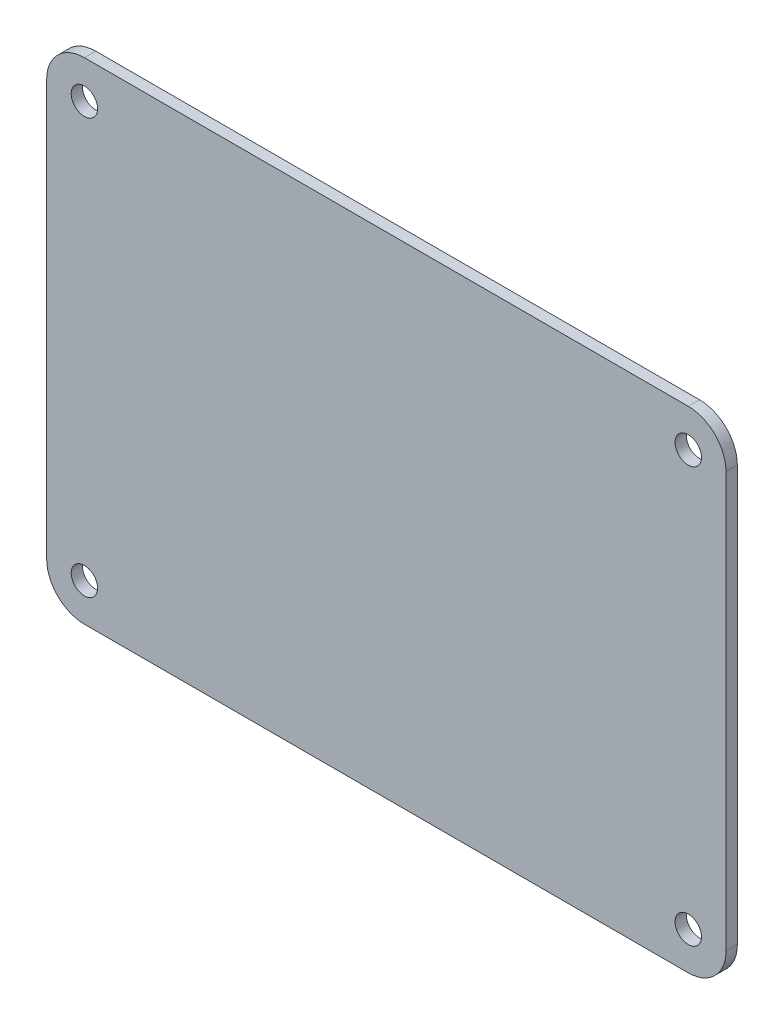
ISO-10303-21;
HEADER;
FILE_DESCRIPTION(('STEP AP214'),'2;1');
FILE_NAME('part.step','',(''),(''),'','','');
FILE_SCHEMA(('AUTOMOTIVE_DESIGN { 1 0 10303 214 1 1 1 1 }'));
ENDSEC;
DATA;
#1=APPLICATION_CONTEXT('core data for automotive mechanical design processes');
#2=APPLICATION_PROTOCOL_DEFINITION('international standard','automotive_design',2000,#1);
#3=PRODUCT_CONTEXT('',#1,'mechanical');
#4=PRODUCT('Part','Part','',(#3));
#5=PRODUCT_RELATED_PRODUCT_CATEGORY('part','',(#4));
#6=PRODUCT_DEFINITION_FORMATION('','',#4);
#7=PRODUCT_DEFINITION_CONTEXT('part definition',#1,'design');
#8=PRODUCT_DEFINITION('design','',#6,#7);
#9=PRODUCT_DEFINITION_SHAPE('','',#8);
#10=(LENGTH_UNIT() NAMED_UNIT(*) SI_UNIT(.MILLI.,.METRE.));
#11=(NAMED_UNIT(*) PLANE_ANGLE_UNIT() SI_UNIT($,.RADIAN.));
#12=(NAMED_UNIT(*) SI_UNIT($,.STERADIAN.) SOLID_ANGLE_UNIT());
#13=UNCERTAINTY_MEASURE_WITH_UNIT(LENGTH_MEASURE(1.E-05),#10,'distance_accuracy_value','');
#14=(GEOMETRIC_REPRESENTATION_CONTEXT(3) GLOBAL_UNCERTAINTY_ASSIGNED_CONTEXT((#13)) GLOBAL_UNIT_ASSIGNED_CONTEXT((#10,
#11,#12)) REPRESENTATION_CONTEXT('',''));
#15=CARTESIAN_POINT('',(0.,0.,0.));
#16=DIRECTION('',(0.,0.,1.));
#17=DIRECTION('',(1.,0.,0.));
#18=AXIS2_PLACEMENT_3D('',#15,#16,#17);
#19=CARTESIAN_POINT('',(90.,65.,3.));
#20=DIRECTION('',(-1.,0.,0.));
#21=DIRECTION('',(0.,-1.,0.));
#22=AXIS2_PLACEMENT_3D('',#19,#20,#21);
#23=PLANE('',#22);
#24=DIRECTION('',(0.,1.,0.));
#25=VECTOR('',#24,1.);
#26=CARTESIAN_POINT('',(90.,65.,0.));
#27=LINE('',#26,#25);
#28=CARTESIAN_POINT('',(90.,-55.,0.));
#29=VERTEX_POINT('',#28);
#30=CARTESIAN_POINT('',(90.,55.,0.));
#31=VERTEX_POINT('',#30);
#32=EDGE_CURVE('E129',#29,#31,#27,.T.);
#33=ORIENTED_EDGE('',*,*,#32,.T.);
#34=DIRECTION('',(0.,0.,-1.));
#35=VECTOR('',#34,1.);
#36=CARTESIAN_POINT('',(90.,55.,3.));
#37=LINE('',#36,#35);
#38=CARTESIAN_POINT('',(90.,55.,3.));
#39=VERTEX_POINT('',#38);
#40=EDGE_CURVE('E152',#31,#39,#37,.F.);
#41=ORIENTED_EDGE('',*,*,#40,.T.);
#42=DIRECTION('',(0.,1.,0.));
#43=VECTOR('',#42,1.);
#44=CARTESIAN_POINT('',(90.,65.,3.));
#45=LINE('',#44,#43);
#46=CARTESIAN_POINT('',(90.,-55.,3.));
#47=VERTEX_POINT('',#46);
#48=EDGE_CURVE('E127',#47,#39,#45,.T.);
#49=ORIENTED_EDGE('',*,*,#48,.F.);
#50=DIRECTION('',(0.,0.,-1.));
#51=VECTOR('',#50,1.);
#52=CARTESIAN_POINT('',(90.,-55.,3.));
#53=LINE('',#52,#51);
#54=EDGE_CURVE('E149',#47,#29,#53,.T.);
#55=ORIENTED_EDGE('',*,*,#54,.T.);
#56=EDGE_LOOP('',(#33,#41,#49,#55));
#57=FACE_BOUND('',#56,.T.);
#58=ADVANCED_FACE('F34',(#57),#23,.F.);
#59=CARTESIAN_POINT('',(-90.,65.,3.));
#60=DIRECTION('',(0.,-1.,0.));
#61=DIRECTION('',(0.,0.,-1.));
#62=AXIS2_PLACEMENT_3D('',#59,#60,#61);
#63=PLANE('',#62);
#64=DIRECTION('',(-1.,0.,0.));
#65=VECTOR('',#64,1.);
#66=CARTESIAN_POINT('',(-90.,65.,0.));
#67=LINE('',#66,#65);
#68=CARTESIAN_POINT('',(79.9999999999999,65.,0.));
#69=VERTEX_POINT('',#68);
#70=CARTESIAN_POINT('',(-80.,65.,0.));
#71=VERTEX_POINT('',#70);
#72=EDGE_CURVE('E125',#69,#71,#67,.T.);
#73=ORIENTED_EDGE('',*,*,#72,.T.);
#74=DIRECTION('',(0.,0.,-1.));
#75=VECTOR('',#74,1.);
#76=CARTESIAN_POINT('',(-80.,65.,3.));
#77=LINE('',#76,#75);
#78=CARTESIAN_POINT('',(-80.,65.,3.));
#79=VERTEX_POINT('',#78);
#80=EDGE_CURVE('E104',#71,#79,#77,.F.);
#81=ORIENTED_EDGE('',*,*,#80,.T.);
#82=DIRECTION('',(-1.,0.,0.));
#83=VECTOR('',#82,1.);
#84=CARTESIAN_POINT('',(-90.,65.,3.));
#85=LINE('',#84,#83);
#86=CARTESIAN_POINT('',(79.9999999999999,65.,3.));
#87=VERTEX_POINT('',#86);
#88=EDGE_CURVE('E168',#87,#79,#85,.T.);
#89=ORIENTED_EDGE('',*,*,#88,.F.);
#90=DIRECTION('',(0.,0.,-1.));
#91=VECTOR('',#90,1.);
#92=CARTESIAN_POINT('',(80.,65.,3.));
#93=LINE('',#92,#91);
#94=EDGE_CURVE('E109',#87,#69,#93,.T.);
#95=ORIENTED_EDGE('',*,*,#94,.T.);
#96=EDGE_LOOP('',(#73,#81,#89,#95));
#97=FACE_BOUND('',#96,.T.);
#98=ADVANCED_FACE('F223',(#97),#63,.F.);
#99=CARTESIAN_POINT('',(-90.,65.,3.));
#100=DIRECTION('',(1.,0.,0.));
#101=DIRECTION('',(0.,1.,0.));
#102=AXIS2_PLACEMENT_3D('',#99,#100,#101);
#103=PLANE('',#102);
#104=DIRECTION('',(0.,-1.,0.));
#105=VECTOR('',#104,1.);
#106=CARTESIAN_POINT('',(-90.,65.,3.));
#107=LINE('',#106,#105);
#108=CARTESIAN_POINT('',(-90.,55.,3.));
#109=VERTEX_POINT('',#108);
#110=CARTESIAN_POINT('',(-90.,-55.,3.));
#111=VERTEX_POINT('',#110);
#112=EDGE_CURVE('E118',#109,#111,#107,.T.);
#113=ORIENTED_EDGE('',*,*,#112,.F.);
#114=DIRECTION('',(0.,0.,-1.));
#115=VECTOR('',#114,1.);
#116=CARTESIAN_POINT('',(-90.,55.,3.));
#117=LINE('',#116,#115);
#118=CARTESIAN_POINT('',(-90.,55.,0.));
#119=VERTEX_POINT('',#118);
#120=EDGE_CURVE('E103',#109,#119,#117,.T.);
#121=ORIENTED_EDGE('',*,*,#120,.T.);
#122=DIRECTION('',(0.,-1.,0.));
#123=VECTOR('',#122,1.);
#124=CARTESIAN_POINT('',(-90.,65.,0.));
#125=LINE('',#124,#123);
#126=CARTESIAN_POINT('',(-90.,-55.,0.));
#127=VERTEX_POINT('',#126);
#128=EDGE_CURVE('E116',#119,#127,#125,.T.);
#129=ORIENTED_EDGE('',*,*,#128,.T.);
#130=DIRECTION('',(0.,0.,-1.));
#131=VECTOR('',#130,1.);
#132=CARTESIAN_POINT('',(-90.,-55.,3.));
#133=LINE('',#132,#131);
#134=EDGE_CURVE('E120',#127,#111,#133,.F.);
#135=ORIENTED_EDGE('',*,*,#134,.T.);
#136=EDGE_LOOP('',(#113,#121,#129,#135));
#137=FACE_BOUND('',#136,.T.);
#138=ADVANCED_FACE('F115',(#137),#103,.F.);
#139=CARTESIAN_POINT('',(-90.,-65.,3.));
#140=DIRECTION('',(0.,1.,0.));
#141=DIRECTION('',(0.,0.,1.));
#142=AXIS2_PLACEMENT_3D('',#139,#140,#141);
#143=PLANE('',#142);
#144=DIRECTION('',(1.,0.,0.));
#145=VECTOR('',#144,1.);
#146=CARTESIAN_POINT('',(-90.,-65.,0.));
#147=LINE('',#146,#145);
#148=CARTESIAN_POINT('',(-80.,-65.,0.));
#149=VERTEX_POINT('',#148);
#150=CARTESIAN_POINT('',(80.,-65.,0.));
#151=VERTEX_POINT('',#150);
#152=EDGE_CURVE('E124',#149,#151,#147,.T.);
#153=ORIENTED_EDGE('',*,*,#152,.T.);
#154=DIRECTION('',(0.,0.,-1.));
#155=VECTOR('',#154,1.);
#156=CARTESIAN_POINT('',(80.,-65.,3.));
#157=LINE('',#156,#155);
#158=CARTESIAN_POINT('',(80.,-65.,3.));
#159=VERTEX_POINT('',#158);
#160=EDGE_CURVE('E11',#151,#159,#157,.F.);
#161=ORIENTED_EDGE('',*,*,#160,.T.);
#162=DIRECTION('',(1.,0.,0.));
#163=VECTOR('',#162,1.);
#164=CARTESIAN_POINT('',(-90.,-65.,3.));
#165=LINE('',#164,#163);
#166=CARTESIAN_POINT('',(-80.,-65.,3.));
#167=VERTEX_POINT('',#166);
#168=EDGE_CURVE('E133',#167,#159,#165,.T.);
#169=ORIENTED_EDGE('',*,*,#168,.F.);
#170=DIRECTION('',(0.,0.,-1.));
#171=VECTOR('',#170,1.);
#172=CARTESIAN_POINT('',(-80.,-65.,3.));
#173=LINE('',#172,#171);
#174=EDGE_CURVE('E42',#167,#149,#173,.T.);
#175=ORIENTED_EDGE('',*,*,#174,.T.);
#176=EDGE_LOOP('',(#153,#161,#169,#175));
#177=FACE_BOUND('',#176,.T.);
#178=ADVANCED_FACE('F155',(#177),#143,.F.);
#179=CARTESIAN_POINT('',(90.,-65.,3.));
#180=DIRECTION('',(0.,0.,1.));
#181=DIRECTION('',(1.,0.,0.));
#182=AXIS2_PLACEMENT_3D('',#179,#180,#181);
#183=PLANE('',#182);
#184=CARTESIAN_POINT('',(80.,-55.,3.));
#185=DIRECTION('',(0.,0.,1.));
#186=DIRECTION('',(1.,0.,0.));
#187=AXIS2_PLACEMENT_3D('',#184,#185,#186);
#188=CIRCLE('',#187,3.50000000000001);
#189=CARTESIAN_POINT('',(83.5,-55.,3.));
#190=VERTEX_POINT('',#189);
#191=EDGE_CURVE('E196',#190,#190,#188,.T.);
#192=ORIENTED_EDGE('',*,*,#191,.F.);
#193=EDGE_LOOP('',(#192));
#194=FACE_BOUND('',#193,.T.);
#195=CARTESIAN_POINT('',(80.,55.,3.));
#196=DIRECTION('',(0.,0.,1.));
#197=DIRECTION('',(1.,0.,0.));
#198=AXIS2_PLACEMENT_3D('',#195,#196,#197);
#199=CIRCLE('',#198,3.50000000000001);
#200=CARTESIAN_POINT('',(83.5,55.,3.));
#201=VERTEX_POINT('',#200);
#202=EDGE_CURVE('E190',#201,#201,#199,.T.);
#203=ORIENTED_EDGE('',*,*,#202,.F.);
#204=EDGE_LOOP('',(#203));
#205=FACE_BOUND('',#204,.T.);
#206=CARTESIAN_POINT('',(-80.,-55.,3.));
#207=DIRECTION('',(0.,0.,1.));
#208=DIRECTION('',(1.,0.,0.));
#209=AXIS2_PLACEMENT_3D('',#206,#207,#208);
#210=CIRCLE('',#209,3.50000000000001);
#211=CARTESIAN_POINT('',(-76.5,-55.,3.));
#212=VERTEX_POINT('',#211);
#213=EDGE_CURVE('E184',#212,#212,#210,.T.);
#214=ORIENTED_EDGE('',*,*,#213,.F.);
#215=EDGE_LOOP('',(#214));
#216=FACE_BOUND('',#215,.T.);
#217=CARTESIAN_POINT('',(-80.,55.,3.));
#218=DIRECTION('',(0.,0.,1.));
#219=DIRECTION('',(1.,0.,0.));
#220=AXIS2_PLACEMENT_3D('',#217,#218,#219);
#221=CIRCLE('',#220,3.50000000000001);
#222=CARTESIAN_POINT('',(-76.5,55.,3.));
#223=VERTEX_POINT('',#222);
#224=EDGE_CURVE('E173',#223,#223,#221,.T.);
#225=ORIENTED_EDGE('',*,*,#224,.F.);
#226=EDGE_LOOP('',(#225));
#227=FACE_BOUND('',#226,.T.);
#228=ORIENTED_EDGE('',*,*,#88,.T.);
#229=CARTESIAN_POINT('',(-80.,55.,3.));
#230=DIRECTION('',(0.,0.,1.));
#231=DIRECTION('',(1.,0.,0.));
#232=AXIS2_PLACEMENT_3D('',#229,#230,#231);
#233=CIRCLE('',#232,10.);
#234=EDGE_CURVE('E147',#79,#109,#233,.T.);
#235=ORIENTED_EDGE('',*,*,#234,.T.);
#236=ORIENTED_EDGE('',*,*,#112,.T.);
#237=CARTESIAN_POINT('',(-80.,-55.,3.));
#238=DIRECTION('',(0.,0.,1.));
#239=DIRECTION('',(1.,0.,0.));
#240=AXIS2_PLACEMENT_3D('',#237,#238,#239);
#241=CIRCLE('',#240,10.);
#242=EDGE_CURVE('E54',#111,#167,#241,.T.);
#243=ORIENTED_EDGE('',*,*,#242,.T.);
#244=ORIENTED_EDGE('',*,*,#168,.T.);
#245=CARTESIAN_POINT('',(80.,-55.,3.));
#246=DIRECTION('',(0.,0.,1.));
#247=DIRECTION('',(1.,0.,0.));
#248=AXIS2_PLACEMENT_3D('',#245,#246,#247);
#249=CIRCLE('',#248,10.);
#250=EDGE_CURVE('E143',#159,#47,#249,.T.);
#251=ORIENTED_EDGE('',*,*,#250,.T.);
#252=ORIENTED_EDGE('',*,*,#48,.T.);
#253=CARTESIAN_POINT('',(80.,55.,3.));
#254=DIRECTION('',(0.,0.,1.));
#255=DIRECTION('',(1.,0.,0.));
#256=AXIS2_PLACEMENT_3D('',#253,#254,#255);
#257=CIRCLE('',#256,10.);
#258=EDGE_CURVE('E145',#39,#87,#257,.T.);
#259=ORIENTED_EDGE('',*,*,#258,.T.);
#260=EDGE_LOOP('',(#228,#235,#236,#243,#244,#251,#252,#259));
#261=FACE_BOUND('',#260,.T.);
#262=ADVANCED_FACE('F211',(#194,#205,#216,#227,#261),#183,.T.);
#263=CARTESIAN_POINT('',(90.,-65.,0.));
#264=DIRECTION('',(0.,0.,1.));
#265=DIRECTION('',(1.,0.,0.));
#266=AXIS2_PLACEMENT_3D('',#263,#264,#265);
#267=PLANE('',#266);
#268=CARTESIAN_POINT('',(80.,-55.,0.));
#269=DIRECTION('',(0.,0.,1.));
#270=DIRECTION('',(1.,0.,0.));
#271=AXIS2_PLACEMENT_3D('',#268,#269,#270);
#272=CIRCLE('',#271,3.50000000000001);
#273=CARTESIAN_POINT('',(83.5,-55.,0.));
#274=VERTEX_POINT('',#273);
#275=EDGE_CURVE('E193',#274,#274,#272,.T.);
#276=ORIENTED_EDGE('',*,*,#275,.T.);
#277=EDGE_LOOP('',(#276));
#278=FACE_BOUND('',#277,.T.);
#279=CARTESIAN_POINT('',(80.,55.,0.));
#280=DIRECTION('',(0.,0.,1.));
#281=DIRECTION('',(1.,0.,0.));
#282=AXIS2_PLACEMENT_3D('',#279,#280,#281);
#283=CIRCLE('',#282,3.50000000000001);
#284=CARTESIAN_POINT('',(83.5,55.,0.));
#285=VERTEX_POINT('',#284);
#286=EDGE_CURVE('E187',#285,#285,#283,.T.);
#287=ORIENTED_EDGE('',*,*,#286,.T.);
#288=EDGE_LOOP('',(#287));
#289=FACE_BOUND('',#288,.T.);
#290=CARTESIAN_POINT('',(-80.,-55.,0.));
#291=DIRECTION('',(0.,0.,1.));
#292=DIRECTION('',(1.,0.,0.));
#293=AXIS2_PLACEMENT_3D('',#290,#291,#292);
#294=CIRCLE('',#293,3.50000000000001);
#295=CARTESIAN_POINT('',(-76.5,-55.,0.));
#296=VERTEX_POINT('',#295);
#297=EDGE_CURVE('E182',#296,#296,#294,.T.);
#298=ORIENTED_EDGE('',*,*,#297,.T.);
#299=EDGE_LOOP('',(#298));
#300=FACE_BOUND('',#299,.T.);
#301=CARTESIAN_POINT('',(-80.,55.,0.));
#302=DIRECTION('',(0.,0.,1.));
#303=DIRECTION('',(1.,0.,0.));
#304=AXIS2_PLACEMENT_3D('',#301,#302,#303);
#305=CIRCLE('',#304,3.50000000000001);
#306=CARTESIAN_POINT('',(-76.5,55.,0.));
#307=VERTEX_POINT('',#306);
#308=EDGE_CURVE('E177',#307,#307,#305,.T.);
#309=ORIENTED_EDGE('',*,*,#308,.T.);
#310=EDGE_LOOP('',(#309));
#311=FACE_BOUND('',#310,.T.);
#312=ORIENTED_EDGE('',*,*,#128,.F.);
#313=CARTESIAN_POINT('',(-80.,55.,0.));
#314=DIRECTION('',(0.,0.,1.));
#315=DIRECTION('',(1.,0.,0.));
#316=AXIS2_PLACEMENT_3D('',#313,#314,#315);
#317=CIRCLE('',#316,10.);
#318=EDGE_CURVE('E99',#119,#71,#317,.F.);
#319=ORIENTED_EDGE('',*,*,#318,.T.);
#320=ORIENTED_EDGE('',*,*,#72,.F.);
#321=CARTESIAN_POINT('',(80.,55.,0.));
#322=DIRECTION('',(0.,0.,1.));
#323=DIRECTION('',(1.,0.,0.));
#324=AXIS2_PLACEMENT_3D('',#321,#322,#323);
#325=CIRCLE('',#324,10.);
#326=EDGE_CURVE('E110',#69,#31,#325,.F.);
#327=ORIENTED_EDGE('',*,*,#326,.T.);
#328=ORIENTED_EDGE('',*,*,#32,.F.);
#329=CARTESIAN_POINT('',(80.,-55.,0.));
#330=DIRECTION('',(0.,0.,1.));
#331=DIRECTION('',(1.,0.,0.));
#332=AXIS2_PLACEMENT_3D('',#329,#330,#331);
#333=CIRCLE('',#332,10.);
#334=EDGE_CURVE('E136',#29,#151,#333,.F.);
#335=ORIENTED_EDGE('',*,*,#334,.T.);
#336=ORIENTED_EDGE('',*,*,#152,.F.);
#337=CARTESIAN_POINT('',(-80.,-55.,0.));
#338=DIRECTION('',(0.,0.,1.));
#339=DIRECTION('',(1.,0.,0.));
#340=AXIS2_PLACEMENT_3D('',#337,#338,#339);
#341=CIRCLE('',#340,10.);
#342=EDGE_CURVE('E119',#149,#127,#341,.F.);
#343=ORIENTED_EDGE('',*,*,#342,.T.);
#344=EDGE_LOOP('',(#312,#319,#320,#327,#328,#335,#336,#343));
#345=FACE_BOUND('',#344,.T.);
#346=ADVANCED_FACE('F122',(#278,#289,#300,#311,#345),#267,.F.);
#347=CARTESIAN_POINT('',(-80.,55.,3.));
#348=DIRECTION('',(0.,0.,-1.));
#349=DIRECTION('',(-1.,0.,0.));
#350=AXIS2_PLACEMENT_3D('',#347,#348,#349);
#351=CYLINDRICAL_SURFACE('',#350,10.);
#352=ORIENTED_EDGE('',*,*,#234,.F.);
#353=ORIENTED_EDGE('',*,*,#80,.F.);
#354=ORIENTED_EDGE('',*,*,#318,.F.);
#355=ORIENTED_EDGE('',*,*,#120,.F.);
#356=EDGE_LOOP('',(#352,#353,#354,#355));
#357=FACE_BOUND('',#356,.T.);
#358=ADVANCED_FACE('F102',(#357),#351,.T.);
#359=CARTESIAN_POINT('',(80.,55.,3.));
#360=DIRECTION('',(0.,0.,-1.));
#361=DIRECTION('',(-1.,0.,0.));
#362=AXIS2_PLACEMENT_3D('',#359,#360,#361);
#363=CYLINDRICAL_SURFACE('',#362,10.);
#364=ORIENTED_EDGE('',*,*,#258,.F.);
#365=ORIENTED_EDGE('',*,*,#40,.F.);
#366=ORIENTED_EDGE('',*,*,#326,.F.);
#367=ORIENTED_EDGE('',*,*,#94,.F.);
#368=EDGE_LOOP('',(#364,#365,#366,#367));
#369=FACE_BOUND('',#368,.T.);
#370=ADVANCED_FACE('F225',(#369),#363,.T.);
#371=CARTESIAN_POINT('',(80.,-55.,3.));
#372=DIRECTION('',(0.,0.,-1.));
#373=DIRECTION('',(-1.,0.,0.));
#374=AXIS2_PLACEMENT_3D('',#371,#372,#373);
#375=CYLINDRICAL_SURFACE('',#374,10.);
#376=ORIENTED_EDGE('',*,*,#250,.F.);
#377=ORIENTED_EDGE('',*,*,#160,.F.);
#378=ORIENTED_EDGE('',*,*,#334,.F.);
#379=ORIENTED_EDGE('',*,*,#54,.F.);
#380=EDGE_LOOP('',(#376,#377,#378,#379));
#381=FACE_BOUND('',#380,.T.);
#382=ADVANCED_FACE('F162',(#381),#375,.T.);
#383=CARTESIAN_POINT('',(-80.,-55.,3.));
#384=DIRECTION('',(0.,0.,-1.));
#385=DIRECTION('',(-1.,0.,0.));
#386=AXIS2_PLACEMENT_3D('',#383,#384,#385);
#387=CYLINDRICAL_SURFACE('',#386,10.);
#388=ORIENTED_EDGE('',*,*,#242,.F.);
#389=ORIENTED_EDGE('',*,*,#134,.F.);
#390=ORIENTED_EDGE('',*,*,#342,.F.);
#391=ORIENTED_EDGE('',*,*,#174,.F.);
#392=EDGE_LOOP('',(#388,#389,#390,#391));
#393=FACE_BOUND('',#392,.T.);
#394=ADVANCED_FACE('F36',(#393),#387,.T.);
#395=CARTESIAN_POINT('',(-80.,55.,0.));
#396=DIRECTION('',(0.,0.,1.));
#397=DIRECTION('',(1.,0.,0.));
#398=AXIS2_PLACEMENT_3D('',#395,#396,#397);
#399=CYLINDRICAL_SURFACE('',#398,3.50000000000001);
#400=ORIENTED_EDGE('',*,*,#308,.F.);
#401=EDGE_LOOP('',(#400));
#402=FACE_BOUND('',#401,.T.);
#403=ORIENTED_EDGE('',*,*,#224,.T.);
#404=EDGE_LOOP('',(#403));
#405=FACE_BOUND('',#404,.T.);
#406=ADVANCED_FACE('F246',(#402,#405),#399,.F.);
#407=CARTESIAN_POINT('',(-80.,-55.,0.));
#408=DIRECTION('',(0.,0.,1.));
#409=DIRECTION('',(1.,0.,0.));
#410=AXIS2_PLACEMENT_3D('',#407,#408,#409);
#411=CYLINDRICAL_SURFACE('',#410,3.50000000000001);
#412=ORIENTED_EDGE('',*,*,#297,.F.);
#413=EDGE_LOOP('',(#412));
#414=FACE_BOUND('',#413,.T.);
#415=ORIENTED_EDGE('',*,*,#213,.T.);
#416=EDGE_LOOP('',(#415));
#417=FACE_BOUND('',#416,.T.);
#418=ADVANCED_FACE('F249',(#414,#417),#411,.F.);
#419=CARTESIAN_POINT('',(80.,55.,0.));
#420=DIRECTION('',(0.,0.,1.));
#421=DIRECTION('',(1.,0.,0.));
#422=AXIS2_PLACEMENT_3D('',#419,#420,#421);
#423=CYLINDRICAL_SURFACE('',#422,3.50000000000001);
#424=ORIENTED_EDGE('',*,*,#286,.F.);
#425=EDGE_LOOP('',(#424));
#426=FACE_BOUND('',#425,.T.);
#427=ORIENTED_EDGE('',*,*,#202,.T.);
#428=EDGE_LOOP('',(#427));
#429=FACE_BOUND('',#428,.T.);
#430=ADVANCED_FACE('F207',(#426,#429),#423,.F.);
#431=CARTESIAN_POINT('',(80.,-55.,0.));
#432=DIRECTION('',(0.,0.,1.));
#433=DIRECTION('',(1.,0.,0.));
#434=AXIS2_PLACEMENT_3D('',#431,#432,#433);
#435=CYLINDRICAL_SURFACE('',#434,3.50000000000001);
#436=ORIENTED_EDGE('',*,*,#275,.F.);
#437=EDGE_LOOP('',(#436));
#438=FACE_BOUND('',#437,.T.);
#439=ORIENTED_EDGE('',*,*,#191,.T.);
#440=EDGE_LOOP('',(#439));
#441=FACE_BOUND('',#440,.T.);
#442=ADVANCED_FACE('F204',(#438,#441),#435,.F.);
#443=CLOSED_SHELL('',(#58,#98,#138,#178,#262,#346,#358,#370,#382,#394,#406,#418,#430,#442));
#444=MANIFOLD_SOLID_BREP('B2',#443);
#445=ADVANCED_BREP_SHAPE_REPRESENTATION('',(#18,#444),#14);
#446=SHAPE_DEFINITION_REPRESENTATION(#9,#445);
ENDSEC;
END-ISO-10303-21;
